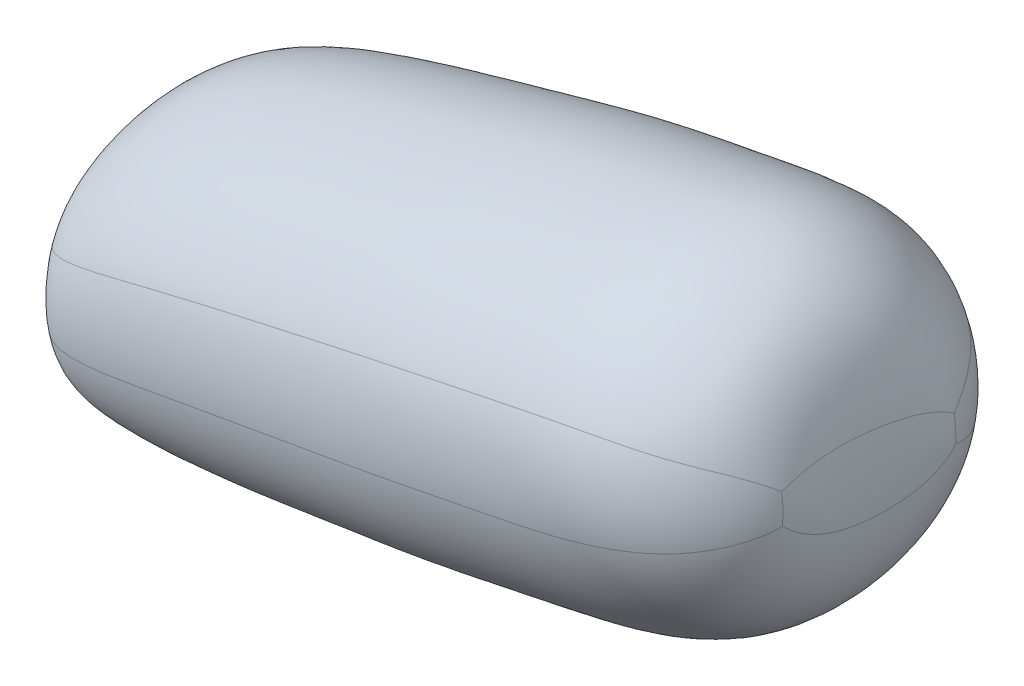
ISO-10303-21;
HEADER;
FILE_DESCRIPTION(('STEP AP214'),'2;1');
FILE_NAME('part.step','',(''),(''),'','','');
FILE_SCHEMA(('AUTOMOTIVE_DESIGN { 1 0 10303 214 1 1 1 1 }'));
ENDSEC;
DATA;
#1=APPLICATION_CONTEXT('core data for automotive mechanical design processes');
#2=APPLICATION_PROTOCOL_DEFINITION('international standard','automotive_design',2000,#1);
#3=PRODUCT_CONTEXT('',#1,'mechanical');
#4=PRODUCT('Part','Part','',(#3));
#5=PRODUCT_RELATED_PRODUCT_CATEGORY('part','',(#4));
#6=PRODUCT_DEFINITION_FORMATION('','',#4);
#7=PRODUCT_DEFINITION_CONTEXT('part definition',#1,'design');
#8=PRODUCT_DEFINITION('design','',#6,#7);
#9=PRODUCT_DEFINITION_SHAPE('','',#8);
#10=(LENGTH_UNIT() NAMED_UNIT(*) SI_UNIT(.MILLI.,.METRE.));
#11=(NAMED_UNIT(*) PLANE_ANGLE_UNIT() SI_UNIT($,.RADIAN.));
#12=(NAMED_UNIT(*) SI_UNIT($,.STERADIAN.) SOLID_ANGLE_UNIT());
#13=UNCERTAINTY_MEASURE_WITH_UNIT(LENGTH_MEASURE(1.E-05),#10,'distance_accuracy_value','');
#14=(GEOMETRIC_REPRESENTATION_CONTEXT(3) GLOBAL_UNCERTAINTY_ASSIGNED_CONTEXT((#13)) GLOBAL_UNIT_ASSIGNED_CONTEXT((#10,
#11,#12)) REPRESENTATION_CONTEXT('',''));
#15=CARTESIAN_POINT('',(0.,0.,0.));
#16=DIRECTION('',(0.,0.,1.));
#17=DIRECTION('',(1.,0.,0.));
#18=AXIS2_PLACEMENT_3D('',#15,#16,#17);
#19=CARTESIAN_POINT('',(-749.018489108599,1299.29948109935,-39.324095367069));
#20=CARTESIAN_POINT('',(-748.967970527326,1299.12750424513,-39.110239315957));
#21=CARTESIAN_POINT('',(-748.92179030598,1298.60052251188,-38.3957189993));
#22=CARTESIAN_POINT('',(-748.958201473464,1298.18935117655,-36.5443591677693));
#23=CARTESIAN_POINT('',(-749.06730665675,1298.22401597437,-34.3212711813403));
#24=CARTESIAN_POINT('',(-749.170756127106,1298.80543309046,-32.4720078110242));
#25=CARTESIAN_POINT('',(-749.317506592092,1299.42247015754,-31.7429129763975));
#26=CARTESIAN_POINT('',(-749.403490624089,1299.62465892125,-31.534316593217));
#27=CARTESIAN_POINT('',(-749.084801293097,1299.15543549282,-39.5639044364465));
#28=CARTESIAN_POINT('',(-749.050076315045,1298.6674361778,-39.3760014036215));
#29=CARTESIAN_POINT('',(-748.985153114867,1297.81794342647,-38.6020268331485));
#30=CARTESIAN_POINT('',(-749.003595215529,1297.12819720907,-36.5922889361603));
#31=CARTESIAN_POINT('',(-749.103906166947,1297.14203600984,-34.1606330428698));
#32=CARTESIAN_POINT('',(-749.21027710687,1298.01210105519,-32.195730785236));
#33=CARTESIAN_POINT('',(-749.393274203634,1298.96932822741,-31.4265141414041));
#34=CARTESIAN_POINT('',(-749.484366445849,1299.49918233803,-31.271818984141));
#35=CARTESIAN_POINT('',(-749.508277162153,1298.74760625145,-40.6770262946794));
#36=CARTESIAN_POINT('',(-749.457142232618,1297.9445234195,-40.4426507010464));
#37=CARTESIAN_POINT('',(-749.367864881999,1296.45824750499,-39.4598318134615));
#38=CARTESIAN_POINT('',(-749.365095308155,1295.21242315377,-36.880036828837));
#39=CARTESIAN_POINT('',(-749.482926647528,1295.19038210665,-33.7122038886789));
#40=CARTESIAN_POINT('',(-749.597785347056,1296.68025179217,-31.240581718492));
#41=CARTESIAN_POINT('',(-749.856086266719,1298.32539989258,-30.280357343591));
#42=CARTESIAN_POINT('',(-749.994240268324,1299.19221905066,-30.101039113443));
#43=CARTESIAN_POINT('',(-751.159048941229,1298.16258940699,-42.5300455490338));
#44=CARTESIAN_POINT('',(-751.090687071207,1297.03134036523,-42.2196471369537));
#45=CARTESIAN_POINT('',(-750.978551612935,1294.87144813529,-40.9205553568457));
#46=CARTESIAN_POINT('',(-750.988372541417,1293.06125687586,-37.4365631027926));
#47=CARTESIAN_POINT('',(-751.134682309766,1293.02708353821,-33.1428445734876));
#48=CARTESIAN_POINT('',(-751.290374837949,1295.13961801561,-29.7994822974853));
#49=CARTESIAN_POINT('',(-751.627641014105,1297.50126731871,-28.5577501991672));
#50=CARTESIAN_POINT('',(-751.811747843912,1298.71780496861,-28.3326523664718));
#51=CARTESIAN_POINT('',(-754.158873201719,1297.75222147314,-44.0965083970222));
#52=CARTESIAN_POINT('',(-754.077910358466,1296.39955738274,-43.7583014981308));
#53=CARTESIAN_POINT('',(-753.928371940029,1293.79672174144,-42.2544839683137));
#54=CARTESIAN_POINT('',(-753.938958652394,1291.66455529155,-38.1002551368529));
#55=CARTESIAN_POINT('',(-754.13647904971,1291.51711330299,-32.7432197820254));
#56=CARTESIAN_POINT('',(-754.185157446263,1294.0676880279,-28.8668044504918));
#57=CARTESIAN_POINT('',(-754.624464378787,1296.90228974008,-27.3498840460618));
#58=CARTESIAN_POINT('',(-754.874130672876,1298.36102383991,-27.0934864291307));
#59=CARTESIAN_POINT('',(-759.26000710208,1296.72639174894,-44.0891917319843));
#60=CARTESIAN_POINT('',(-759.18851954643,1295.38452932136,-43.7633730580967));
#61=CARTESIAN_POINT('',(-759.116812474931,1292.81342528136,-42.3663472178732));
#62=CARTESIAN_POINT('',(-759.051041510436,1290.60776673528,-38.1766387792012));
#63=CARTESIAN_POINT('',(-759.269596267115,1290.50681291285,-32.8324553525363));
#64=CARTESIAN_POINT('',(-759.272844685512,1293.11555768788,-28.6960862887956));
#65=CARTESIAN_POINT('',(-759.591990000017,1295.92878957771,-27.3696049029176));
#66=CARTESIAN_POINT('',(-759.77769174863,1297.36904152769,-27.1633438603408));
#67=CARTESIAN_POINT('',(-764.359546670865,1295.68972114741,-44.1376753076099));
#68=CARTESIAN_POINT('',(-764.297089733093,1294.34977516214,-43.8221455308439));
#69=CARTESIAN_POINT('',(-764.303269737728,1291.79346136581,-42.5233058448082));
#70=CARTESIAN_POINT('',(-764.160389916762,1289.49914396155,-38.2699856202754));
#71=CARTESIAN_POINT('',(-764.401397803234,1289.44428503148,-32.9030554621092));
#72=CARTESIAN_POINT('',(-764.359061717345,1292.12898631363,-28.4774306201283));
#73=CARTESIAN_POINT('',(-764.559338774294,1294.93947886125,-27.3338043413325));
#74=CARTESIAN_POINT('',(-764.681875497786,1296.37073541332,-27.176637277944));
#75=CARTESIAN_POINT('',(-769.305606388331,1294.47853407106,-43.9757094274412));
#76=CARTESIAN_POINT('',(-769.246511662497,1293.17488125367,-43.6646025869355));
#77=CARTESIAN_POINT('',(-769.212113710219,1290.70196483442,-42.4015593398651));
#78=CARTESIAN_POINT('',(-769.304153882563,1288.39490198021,-38.2746156648655));
#79=CARTESIAN_POINT('',(-769.638567077451,1288.42085571348,-33.0708250204242));
#80=CARTESIAN_POINT('',(-769.791654617071,1291.08685156502,-28.8648737740316));
#81=CARTESIAN_POINT('',(-769.980697436857,1293.71909715483,-27.7920740561139));
#82=CARTESIAN_POINT('',(-770.097800696493,1295.06803403571,-27.6409434635129));
#83=CARTESIAN_POINT('',(-774.25007321349,1293.2564999452,-43.8695401630141));
#84=CARTESIAN_POINT('',(-774.193946683919,1291.98026506041,-43.5607703619638));
#85=CARTESIAN_POINT('',(-774.11912298826,1289.5738509498,-42.3249542532714));
#86=CARTESIAN_POINT('',(-774.445027816653,1287.23881556464,-38.2961756445218));
#87=CARTESIAN_POINT('',(-774.874497234806,1287.3452149008,-33.2199760600337));
#88=CARTESIAN_POINT('',(-775.22270074493,1290.01025978561,-29.2043624787532));
#89=CARTESIAN_POINT('',(-775.40180525547,1292.48287601004,-28.1947998693385));
#90=CARTESIAN_POINT('',(-775.514300015313,1293.75898516807,-28.0486692270428));
#91=CARTESIAN_POINT('',(-779.911553258602,1291.88637305131,-43.5344845722859));
#92=CARTESIAN_POINT('',(-779.842074284409,1290.74448452939,-43.205979995121));
#93=CARTESIAN_POINT('',(-779.792314523312,1288.64156983473,-41.9549361328682));
#94=CARTESIAN_POINT('',(-779.969726307725,1286.89547436391,-38.1059025561277));
#95=CARTESIAN_POINT('',(-780.553360116567,1287.11002160491,-33.7430399077221));
#96=CARTESIAN_POINT('',(-780.980196818926,1289.03294102993,-29.8617816019272));
#97=CARTESIAN_POINT('',(-781.03489619997,1291.10256307089,-28.84410530136));
#98=CARTESIAN_POINT('',(-781.088692801074,1292.24591161954,-28.6597444598045));
#99=CARTESIAN_POINT('',(-781.954415149053,1291.85897094687,-41.9991583653068));
#100=CARTESIAN_POINT('',(-781.899991490325,1290.96449120507,-41.7418302327256));
#101=CARTESIAN_POINT('',(-781.860985650573,1289.31721902203,-40.7618449133627));
#102=CARTESIAN_POINT('',(-781.999978437645,1287.9494414387,-37.7467711875539));
#103=CARTESIAN_POINT('',(-782.457077583786,1288.11749766296,-34.3291798409091));
#104=CARTESIAN_POINT('',(-782.791436032879,1289.62377116702,-31.2888533829023));
#105=CARTESIAN_POINT('',(-782.834336592248,1291.24498764779,-30.491688903686));
#106=CARTESIAN_POINT('',(-782.876484609966,1292.14061199119,-30.3472751262383));
#107=CARTESIAN_POINT('',(-783.221014010632,1292.39643433713,-40.1129098322217));
#108=CARTESIAN_POINT('',(-783.185654987031,1291.81502241681,-39.945649891934));
#109=CARTESIAN_POINT('',(-783.160356054684,1290.74429501344,-39.3086711764158));
#110=CARTESIAN_POINT('',(-783.250644958287,1289.8552215429,-37.348858823631));
#111=CARTESIAN_POINT('',(-783.547699954565,1289.96444192545,-35.1274042024291));
#112=CARTESIAN_POINT('',(-783.765113193625,1290.94355771966,-33.1512189835104));
#113=CARTESIAN_POINT('',(-783.792976731724,1291.99733347087,-32.6330566996435));
#114=CARTESIAN_POINT('',(-783.82037407827,1292.57948616962,-32.5391871890176));
#115=CARTESIAN_POINT('',(-783.733798016317,1292.70464010443,-38.9131388769745));
#116=CARTESIAN_POINT('',(-783.710221372087,1292.31703033071,-38.8016304198931));
#117=CARTESIAN_POINT('',(-783.693372327786,1291.60321543548,-38.3769822774933));
#118=CARTESIAN_POINT('',(-783.753536996822,1291.0105076156,-37.0704397479077));
#119=CARTESIAN_POINT('',(-783.951627932896,1291.0833114502,-35.5894764019633));
#120=CARTESIAN_POINT('',(-784.096515664814,1291.73606479513,-34.2720140423367));
#121=CARTESIAN_POINT('',(-784.115074549976,1292.43857877002,-33.9265676154748));
#122=CARTESIAN_POINT('',(-784.133335485837,1292.82667874234,-33.863986111523));
#123=CARTESIAN_POINT('',(-783.824624994582,1292.82199442778,-38.690211108755));
#124=CARTESIAN_POINT('',(-783.85825016158,1292.68686670258,-38.5229929961155));
#125=CARTESIAN_POINT('',(-783.848229116781,1292.23721064092,-38.1581383824137));
#126=CARTESIAN_POINT('',(-783.906715497853,1291.87580281172,-37.0328917067888));
#127=CARTESIAN_POINT('',(-784.072418456832,1291.93059691732,-35.7467567036758));
#128=CARTESIAN_POINT('',(-784.192393077936,1292.34204792775,-34.5957010465759));
#129=CARTESIAN_POINT('',(-784.206751996864,1292.791077441,-34.2763311735864));
#130=CARTESIAN_POINT('',(-784.188366805151,1292.93231119889,-34.1180223182479));
#131=(BOUNDED_SURFACE() B_SPLINE_SURFACE(3,3,((#19,#20,#21,#22,#23,#24,#25,#26),(#27,#28,#29,
#30,#31,#32,#33,#34),(#35,#36,#37,#38,#39,#40,#41,#42),(#43,#44,#45,#46,#47,#48,#49,#50),(#51,
#52,#53,#54,#55,#56,#57,#58),(#59,#60,#61,#62,#63,#64,#65,#66),(#67,#68,#69,#70,#71,#72,#73,
#74),(#75,#76,#77,#78,#79,#80,#81,#82),(#83,#84,#85,#86,#87,#88,#89,#90),(#91,#92,#93,#94,#95,
#96,#97,#98),(#99,#100,#101,#102,#103,#104,#105,#106),(#107,#108,#109,#110,#111,#112,#113,#114),
(#115,#116,#117,#118,#119,#120,#121,#122),(#123,#124,#125,#126,#127,#128,#129,#130)),
.UNSPECIFIED.,.F.,.F.,.F.) B_SPLINE_SURFACE_WITH_KNOTS((4,1,1,1,1,1,1,1,1,1,1,4),(4,1,1,1,1,4),
(0.,1.,2.,3.,4.,5.,6.,7.,8.,9.,10.,11.),(0.,1.,2.,3.,4.,5.),
.UNSPECIFIED.) GEOMETRIC_REPRESENTATION_ITEM() RATIONAL_B_SPLINE_SURFACE(((0.75,1.,1.,1.,1.,1.,
1.,0.75),(1.,1.,1.,1.,1.,1.,1.,1.),(1.,1.,1.,1.,1.,1.,1.,1.),(1.,1.,1.,1.,1.,1.,1.,1.),(1.,1.,
1.,1.,1.,1.,1.,1.),(1.,1.,1.,1.,1.,1.,1.,1.),(1.,1.,1.,1.,1.,1.,1.,1.),(1.,1.,1.,1.,1.,1.,1.,
1.),(1.,1.,1.,1.,1.,1.,1.,1.),(1.,1.,1.,1.,1.,1.,1.,1.),(1.,1.,1.,1.,1.,1.,1.,1.),(1.,1.,1.,1.,
1.,1.,1.,1.),(1.,1.,1.,1.,1.,1.,1.,1.),(0.75,1.,1.,1.,1.,1.,1.,0.75))) REPRESENTATION_ITEM('') SURFACE());
#132=CARTESIAN_POINT('',(-783.824624994582,1292.82199442778,-38.690211108755));
#133=CARTESIAN_POINT('',(-783.733798016317,1292.70464010443,-38.9131388769745));
#134=CARTESIAN_POINT('',(-783.221014010632,1292.39643433713,-40.1129098322217));
#135=CARTESIAN_POINT('',(-781.954415149053,1291.85897094687,-41.9991583653068));
#136=CARTESIAN_POINT('',(-779.911553258602,1291.88637305131,-43.5344845722859));
#137=CARTESIAN_POINT('',(-774.25007321349,1293.2564999452,-43.8695401630141));
#138=CARTESIAN_POINT('',(-769.305606388331,1294.47853407106,-43.9757094274412));
#139=CARTESIAN_POINT('',(-764.359546670865,1295.68972114741,-44.1376753076099));
#140=CARTESIAN_POINT('',(-759.26000710208,1296.72639174894,-44.0891917319843));
#141=CARTESIAN_POINT('',(-754.158873201719,1297.75222147314,-44.0965083970222));
#142=CARTESIAN_POINT('',(-751.159048941229,1298.16258940699,-42.5300455490338));
#143=CARTESIAN_POINT('',(-749.508277162153,1298.74760625145,-40.6770262946794));
#144=CARTESIAN_POINT('',(-749.084801293097,1299.15543549282,-39.5639044364465));
#145=CARTESIAN_POINT('',(-749.018489108599,1299.29948109935,-39.324095367069));
#146=(BOUNDED_CURVE() B_SPLINE_CURVE(3,(#132,#133,#134,#135,#136,#137,#138,#139,#140,#141,#142,
#143,#144,#145),.UNSPECIFIED.,.F.,.F.) B_SPLINE_CURVE_WITH_KNOTS((4,1,1,1,1,1,1,1,1,1,1,4),(0.,
1.,2.,3.,4.,5.,6.,7.,8.,9.,10.,11.),
.UNSPECIFIED.) CURVE() GEOMETRIC_REPRESENTATION_ITEM() RATIONAL_B_SPLINE_CURVE((0.75,1.,1.,1.,
1.,1.,1.,1.,1.,1.,1.,1.,1.,0.75)) REPRESENTATION_ITEM(''));
#147=CARTESIAN_POINT('',(-783.824624994582,1292.82199442778,-38.690211108755));
#148=VERTEX_POINT('',#147);
#149=CARTESIAN_POINT('',(-749.018489108599,1299.29948109935,-39.324095367069));
#150=VERTEX_POINT('',#149);
#151=EDGE_CURVE('E95',#148,#150,#146,.T.);
#152=CARTESIAN_POINT('',(-749.018489108599,1299.29948109935,-39.324095367069));
#153=CARTESIAN_POINT('',(-748.967970527326,1299.12750424513,-39.110239315957));
#154=CARTESIAN_POINT('',(-748.92179030598,1298.60052251188,-38.3957189993));
#155=CARTESIAN_POINT('',(-748.958201473464,1298.18935117655,-36.5443591677693));
#156=CARTESIAN_POINT('',(-749.06730665675,1298.22401597437,-34.3212711813403));
#157=CARTESIAN_POINT('',(-749.170756127106,1298.80543309046,-32.4720078110242));
#158=CARTESIAN_POINT('',(-749.317506592092,1299.42247015754,-31.7429129763975));
#159=CARTESIAN_POINT('',(-749.403490624089,1299.62465892125,-31.534316593217));
#160=(BOUNDED_CURVE() B_SPLINE_CURVE(3,(#152,#153,#154,#155,#156,#157,#158,#159),.UNSPECIFIED.,
.F.,.F.) B_SPLINE_CURVE_WITH_KNOTS((4,1,1,1,1,4),(0.,1.,2.,3.,4.,5.),
.UNSPECIFIED.) CURVE() GEOMETRIC_REPRESENTATION_ITEM() RATIONAL_B_SPLINE_CURVE((0.75,1.,1.,1.,
1.,1.,1.,0.75)) REPRESENTATION_ITEM(''));
#161=CARTESIAN_POINT('',(-749.403490624089,1299.62465892125,-31.534316593217));
#162=VERTEX_POINT('',#161);
#163=EDGE_CURVE('E82',#150,#162,#160,.T.);
#164=CARTESIAN_POINT('',(-749.403490624089,1299.62465892125,-31.534316593217));
#165=CARTESIAN_POINT('',(-749.484366445849,1299.49918233803,-31.271818984141));
#166=CARTESIAN_POINT('',(-749.994240268324,1299.19221905066,-30.101039113443));
#167=CARTESIAN_POINT('',(-751.811747843912,1298.71780496861,-28.3326523664718));
#168=CARTESIAN_POINT('',(-754.874130672876,1298.36102383991,-27.0934864291307));
#169=CARTESIAN_POINT('',(-759.77769174863,1297.36904152769,-27.1633438603408));
#170=CARTESIAN_POINT('',(-764.681875497786,1296.37073541332,-27.176637277944));
#171=CARTESIAN_POINT('',(-770.097800696493,1295.06803403571,-27.6409434635129));
#172=CARTESIAN_POINT('',(-775.514300015313,1293.75898516807,-28.0486692270428));
#173=CARTESIAN_POINT('',(-781.088692801074,1292.24591161954,-28.6597444598045));
#174=CARTESIAN_POINT('',(-782.876484609966,1292.14061199119,-30.3472751262383));
#175=CARTESIAN_POINT('',(-783.82037407827,1292.57948616962,-32.5391871890176));
#176=CARTESIAN_POINT('',(-784.133335485837,1292.82667874234,-33.863986111523));
#177=CARTESIAN_POINT('',(-784.188366805151,1292.93231119889,-34.1180223182479));
#178=(BOUNDED_CURVE() B_SPLINE_CURVE(3,(#164,#165,#166,#167,#168,#169,#170,#171,#172,#173,#174,
#175,#176,#177),.UNSPECIFIED.,.F.,.F.) B_SPLINE_CURVE_WITH_KNOTS((4,1,1,1,1,1,1,1,1,1,1,4),(0.,
1.,2.,3.,4.,5.,6.,7.,8.,9.,10.,11.),
.UNSPECIFIED.) CURVE() GEOMETRIC_REPRESENTATION_ITEM() RATIONAL_B_SPLINE_CURVE((0.75,1.,1.,1.,
1.,1.,1.,1.,1.,1.,1.,1.,1.,0.75)) REPRESENTATION_ITEM(''));
#179=CARTESIAN_POINT('',(-784.188366805151,1292.93231119889,-34.1180223182479));
#180=VERTEX_POINT('',#179);
#181=EDGE_CURVE('E109',#162,#180,#178,.T.);
#182=CARTESIAN_POINT('',(-783.824624994582,1292.82199442778,-38.690211108755));
#183=CARTESIAN_POINT('',(-783.85825016158,1292.68686670258,-38.5229929961155));
#184=CARTESIAN_POINT('',(-783.848229116781,1292.23721064092,-38.1581383824137));
#185=CARTESIAN_POINT('',(-783.906715497853,1291.87580281172,-37.0328917067888));
#186=CARTESIAN_POINT('',(-784.072418456832,1291.93059691732,-35.7467567036758));
#187=CARTESIAN_POINT('',(-784.192393077936,1292.34204792775,-34.5957010465759));
#188=CARTESIAN_POINT('',(-784.206751996864,1292.791077441,-34.2763311735864));
#189=CARTESIAN_POINT('',(-784.188366805151,1292.93231119889,-34.1180223182479));
#190=(BOUNDED_CURVE() B_SPLINE_CURVE(3,(#182,#183,#184,#185,#186,#187,#188,#189),.UNSPECIFIED.,
.F.,.F.) B_SPLINE_CURVE_WITH_KNOTS((4,1,1,1,1,4),(0.,1.,2.,3.,4.,5.),
.UNSPECIFIED.) CURVE() GEOMETRIC_REPRESENTATION_ITEM() RATIONAL_B_SPLINE_CURVE((0.75,1.,1.,1.,
1.,1.,1.,0.75)) REPRESENTATION_ITEM(''));
#191=EDGE_CURVE('E73',#180,#148,#190,.F.);
#192=ORIENTED_EDGE('',*,*,#151,.T.);
#193=ORIENTED_EDGE('',*,*,#163,.T.);
#194=ORIENTED_EDGE('',*,*,#181,.T.);
#195=ORIENTED_EDGE('',*,*,#191,.T.);
#196=EDGE_LOOP('',(#192,#193,#194,#195));
#197=FACE_BOUND('',#196,.T.);
#198=ADVANCED_FACE('F33',(#197),#131,.F.);
#199=CARTESIAN_POINT('',(-749.101198099589,1300.48404316382,-39.3215295309405));
#200=CARTESIAN_POINT('',(-749.073539835806,1300.62872121467,-39.1119811715683));
#201=CARTESIAN_POINT('',(-749.100866221287,1301.05505212928,-38.4399309260042));
#202=CARTESIAN_POINT('',(-749.212592360472,1301.48810966363,-36.6750381359092));
#203=CARTESIAN_POINT('',(-749.398164468555,1301.5930330535,-34.5895874505852));
#204=CARTESIAN_POINT('',(-749.489537624244,1301.36069646779,-32.6765632122549));
#205=CARTESIAN_POINT('',(-749.535269738027,1300.99402252503,-31.9036791666968));
#206=CARTESIAN_POINT('',(-749.578894700072,1300.86605871129,-31.6665667225681));
#207=CARTESIAN_POINT('',(-749.040850375049,1300.17046956504,-39.2934519756941));
#208=CARTESIAN_POINT('',(-748.925186122951,1300.14625206791,-38.8462777017031));
#209=CARTESIAN_POINT('',(-748.923057762875,1300.26841180734,-38.2056979879056));
#210=CARTESIAN_POINT('',(-749.002770293597,1300.41492605134,-36.544443808918));
#211=CARTESIAN_POINT('',(-749.147018366461,1300.49412891637,-34.5789710196671));
#212=CARTESIAN_POINT('',(-749.245947307902,1300.51950456478,-32.8232643550117));
#213=CARTESIAN_POINT('',(-749.321609789028,1300.45993178052,-32.1190310824601));
#214=CARTESIAN_POINT('',(-749.49387720659,1300.53503143215,-31.6556864583636));
#215=CARTESIAN_POINT('',(-749.002695505377,1299.61550356014,-39.2981423487929));
#216=CARTESIAN_POINT('',(-748.885864739596,1299.58757231245,-38.8444772283143));
#217=CARTESIAN_POINT('',(-748.858427497092,1299.38310159727,-38.1894111654515));
#218=CARTESIAN_POINT('',(-748.912807731408,1299.25050514402,-36.4964293993673));
#219=CARTESIAN_POINT('',(-749.030707146552,1299.3059959389,-34.4819093198216));
#220=CARTESIAN_POINT('',(-749.131235147342,1299.59876512575,-32.7482848368125));
#221=CARTESIAN_POINT('',(-749.241738980559,1299.87561208766,-32.0593118113908));
#222=CARTESIAN_POINT('',(-749.408598834316,1299.95232426816,-31.5882178191343));
#223=CARTESIAN_POINT('',(-749.018489108599,1299.29948109935,-39.324095367069));
#224=CARTESIAN_POINT('',(-748.967970527326,1299.12750424513,-39.110239315957));
#225=CARTESIAN_POINT('',(-748.92179030598,1298.60052251188,-38.3957189993));
#226=CARTESIAN_POINT('',(-748.958201473464,1298.18935117655,-36.5443591677693));
#227=CARTESIAN_POINT('',(-749.06730665675,1298.22401597437,-34.3212711813403));
#228=CARTESIAN_POINT('',(-749.170756127106,1298.80543309046,-32.4720078110242));
#229=CARTESIAN_POINT('',(-749.317506592092,1299.42247015754,-31.7429129763975));
#230=CARTESIAN_POINT('',(-749.403490624089,1299.62465892125,-31.534316593217));
#231=(BOUNDED_SURFACE() B_SPLINE_SURFACE(3,3,((#199,#200,#201,#202,#203,#204,#205,#206),(#207,
#208,#209,#210,#211,#212,#213,#214),(#215,#216,#217,#218,#219,#220,#221,#222),(#223,#224,#225,
#226,#227,#228,#229,#230)),.UNSPECIFIED.,.F.,.F.,.F.) B_SPLINE_SURFACE_WITH_KNOTS((4,4),(4,1,1,
1,1,4),(0.,1.),(0.,1.,2.,3.,4.,5.),
.UNSPECIFIED.) GEOMETRIC_REPRESENTATION_ITEM() RATIONAL_B_SPLINE_SURFACE(((0.75,1.,1.,1.,1.,1.,
1.,0.75),(1.,1.,1.,1.,1.,1.,1.,1.),(1.,1.,1.,1.,1.,1.,1.,1.),(0.75,1.,1.,1.,1.,1.,1.,0.75))) REPRESENTATION_ITEM('') SURFACE());
#232=CARTESIAN_POINT('',(-749.101198099589,1300.48404316382,-39.3215295309405));
#233=CARTESIAN_POINT('',(-749.040850375049,1300.17046956504,-39.2934519756941));
#234=CARTESIAN_POINT('',(-749.002695505377,1299.61550356014,-39.2981423487929));
#235=CARTESIAN_POINT('',(-749.018489108599,1299.29948109935,-39.324095367069));
#236=(BOUNDED_CURVE() B_SPLINE_CURVE(3,(#232,#233,#234,#235),.UNSPECIFIED.,.F.,
.F.) B_SPLINE_CURVE_WITH_KNOTS((4,4),(0.,1.),
.UNSPECIFIED.) CURVE() GEOMETRIC_REPRESENTATION_ITEM() RATIONAL_B_SPLINE_CURVE((0.75,1.,1.,0.75)) REPRESENTATION_ITEM(''));
#237=CARTESIAN_POINT('',(-749.101198099589,1300.48404316382,-39.3215295309405));
#238=VERTEX_POINT('',#237);
#239=EDGE_CURVE('E89',#150,#238,#236,.F.);
#240=CARTESIAN_POINT('',(-749.578894700072,1300.86605871129,-31.6665667225681));
#241=CARTESIAN_POINT('',(-749.535269738027,1300.99402252503,-31.9036791666968));
#242=CARTESIAN_POINT('',(-749.489537624244,1301.36069646779,-32.6765632122549));
#243=CARTESIAN_POINT('',(-749.398164468555,1301.5930330535,-34.5895874505852));
#244=CARTESIAN_POINT('',(-749.212592360472,1301.48810966363,-36.6750381359092));
#245=CARTESIAN_POINT('',(-749.100866221287,1301.05505212928,-38.4399309260042));
#246=CARTESIAN_POINT('',(-749.073539835806,1300.62872121467,-39.1119811715683));
#247=CARTESIAN_POINT('',(-749.101198099589,1300.48404316382,-39.3215295309405));
#248=(BOUNDED_CURVE() B_SPLINE_CURVE(3,(#240,#241,#242,#243,#244,#245,#246,#247),.UNSPECIFIED.,
.F.,.F.) B_SPLINE_CURVE_WITH_KNOTS((4,1,1,1,1,4),(0.,1.,2.,3.,4.,5.),
.UNSPECIFIED.) CURVE() GEOMETRIC_REPRESENTATION_ITEM() RATIONAL_B_SPLINE_CURVE((0.75,1.,1.,1.,
1.,1.,1.,0.75)) REPRESENTATION_ITEM(''));
#249=CARTESIAN_POINT('',(-749.578894700072,1300.86605871129,-31.6665667225681));
#250=VERTEX_POINT('',#249);
#251=EDGE_CURVE('E54',#238,#250,#248,.F.);
#252=CARTESIAN_POINT('',(-749.403490624089,1299.62465892125,-31.534316593217));
#253=CARTESIAN_POINT('',(-749.408598834316,1299.95232426816,-31.5882178191343));
#254=CARTESIAN_POINT('',(-749.49387720659,1300.53503143215,-31.6556864583636));
#255=CARTESIAN_POINT('',(-749.578894700072,1300.86605871129,-31.6665667225681));
#256=(BOUNDED_CURVE() B_SPLINE_CURVE(3,(#252,#253,#254,#255),.UNSPECIFIED.,.F.,
.F.) B_SPLINE_CURVE_WITH_KNOTS((4,4),(0.,1.),
.UNSPECIFIED.) CURVE() GEOMETRIC_REPRESENTATION_ITEM() RATIONAL_B_SPLINE_CURVE((0.75,1.,1.,0.75)) REPRESENTATION_ITEM(''));
#257=EDGE_CURVE('E65',#250,#162,#256,.F.);
#258=ORIENTED_EDGE('',*,*,#239,.T.);
#259=ORIENTED_EDGE('',*,*,#251,.T.);
#260=ORIENTED_EDGE('',*,*,#257,.T.);
#261=ORIENTED_EDGE('',*,*,#163,.F.);
#262=EDGE_LOOP('',(#258,#259,#260,#261));
#263=FACE_BOUND('',#262,.T.);
#264=ADVANCED_FACE('F88',(#263),#231,.F.);
#265=CARTESIAN_POINT('',(-783.893814342729,1293.77587627241,-38.7183294621177));
#266=CARTESIAN_POINT('',(-783.820694845313,1293.89112847798,-38.9479489627941));
#267=CARTESIAN_POINT('',(-783.351322479163,1294.17615501707,-40.1651114212732));
#268=CARTESIAN_POINT('',(-782.154925746226,1294.59700567594,-42.0794753155524));
#269=CARTESIAN_POINT('',(-780.167567816432,1295.38172499271,-43.637022510016));
#270=CARTESIAN_POINT('',(-774.497658475344,1297.06253696188,-43.8848743225744));
#271=CARTESIAN_POINT('',(-769.570695864869,1298.35809562624,-43.9680247127822));
#272=CARTESIAN_POINT('',(-764.644056524665,1299.66919865489,-44.1067819397449));
#273=CARTESIAN_POINT('',(-759.532067791023,1300.69865071291,-44.0252837542906));
#274=CARTESIAN_POINT('',(-754.420505250228,1301.74365689664,-43.9994168210762));
#275=CARTESIAN_POINT('',(-751.398107733031,1301.54151953421,-42.5157692096575));
#276=CARTESIAN_POINT('',(-749.67685445444,1301.16871211375,-40.662820602951));
#277=CARTESIAN_POINT('',(-749.189204087912,1300.65293871178,-39.5591554455591));
#278=CARTESIAN_POINT('',(-749.101198099589,1300.48404316382,-39.3215295309405));
#279=CARTESIAN_POINT('',(-783.918078382228,1293.52796691963,-38.6472153189055));
#280=CARTESIAN_POINT('',(-783.796103426886,1293.51056197799,-39.0353401770133));
#281=CARTESIAN_POINT('',(-783.314441615238,1293.60530639639,-40.2962002953258));
#282=CARTESIAN_POINT('',(-782.098183205346,1293.71877408076,-42.281150103342));
#283=CARTESIAN_POINT('',(-780.0951103006,1294.26058126979,-43.8944763726819));
#284=CARTESIAN_POINT('',(-774.381040954399,1295.88199754423,-44.1779415118188));
#285=CARTESIAN_POINT('',(-769.465691589695,1297.15303431359,-44.2775083254067));
#286=CARTESIAN_POINT('',(-764.550007486482,1298.43140220508,-44.4348447948741));
#287=CARTESIAN_POINT('',(-759.438616233273,1299.46642701167,-44.3681348335301));
#288=CARTESIAN_POINT('',(-754.326992522281,1300.50879592372,-44.3592203287496));
#289=CARTESIAN_POINT('',(-751.308066822149,1300.47639041731,-42.8116948952093));
#290=CARTESIAN_POINT('',(-749.617043275484,1300.41371679005,-40.8887436318294));
#291=CARTESIAN_POINT('',(-749.156514627145,1300.19468706216,-39.7406262496741));
#292=CARTESIAN_POINT('',(-749.040850375049,1300.17046956504,-39.2934519756941));
#293=CARTESIAN_POINT('',(-783.88182680582,1293.0744764763,-38.6345014531969));
#294=CARTESIAN_POINT('',(-783.757374660566,1293.09224987815,-39.0246473340667));
#295=CARTESIAN_POINT('',(-783.256373034223,1292.97784625745,-40.2801697725095));
#296=CARTESIAN_POINT('',(-782.008838807773,1292.75345068867,-42.2564864978881));
#297=CARTESIAN_POINT('',(-779.981032232778,1293.02826157324,-43.8629891494619));
#298=CARTESIAN_POINT('',(-774.30619974307,1294.53273482997,-44.1783099640644));
#299=CARTESIAN_POINT('',(-769.364701114166,1295.78218688845,-44.286816267936));
#300=CARTESIAN_POINT('',(-764.422003608637,1297.02966713269,-44.4532050843542));
#301=CARTESIAN_POINT('',(-759.331494657729,1298.06825417651,-44.4150104058611));
#302=CARTESIAN_POINT('',(-754.239836044974,1299.10488556355,-44.4347152958918));
#303=CARTESIAN_POINT('',(-751.227410811251,1299.29383844875,-42.8404439611031));
#304=CARTESIAN_POINT('',(-749.559412091697,1299.5506890834,-40.9114018883342));
#305=CARTESIAN_POINT('',(-749.11952627114,1299.64343480782,-39.7518074692715));
#306=CARTESIAN_POINT('',(-749.002695505377,1299.61550356014,-39.2981423487929));
#307=CARTESIAN_POINT('',(-783.824624994582,1292.82199442778,-38.690211108755));
#308=CARTESIAN_POINT('',(-783.733798016317,1292.70464010443,-38.9131388769745));
#309=CARTESIAN_POINT('',(-783.221014010632,1292.39643433713,-40.1129098322217));
#310=CARTESIAN_POINT('',(-781.954415149053,1291.85897094687,-41.9991583653068));
#311=CARTESIAN_POINT('',(-779.911553258602,1291.88637305131,-43.5344845722859));
#312=CARTESIAN_POINT('',(-774.25007321349,1293.2564999452,-43.8695401630141));
#313=CARTESIAN_POINT('',(-769.305606388331,1294.47853407106,-43.9757094274412));
#314=CARTESIAN_POINT('',(-764.359546670865,1295.68972114741,-44.1376753076099));
#315=CARTESIAN_POINT('',(-759.26000710208,1296.72639174894,-44.0891917319843));
#316=CARTESIAN_POINT('',(-754.158873201719,1297.75222147314,-44.0965083970222));
#317=CARTESIAN_POINT('',(-751.159048941229,1298.16258940699,-42.5300455490338));
#318=CARTESIAN_POINT('',(-749.508277162153,1298.74760625145,-40.6770262946794));
#319=CARTESIAN_POINT('',(-749.084801293097,1299.15543549282,-39.5639044364465));
#320=CARTESIAN_POINT('',(-749.018489108599,1299.29948109935,-39.324095367069));
#321=(BOUNDED_SURFACE() B_SPLINE_SURFACE(3,3,((#265,#266,#267,#268,#269,#270,#271,#272,#273,
#274,#275,#276,#277,#278),(#279,#280,#281,#282,#283,#284,#285,#286,#287,#288,#289,#290,#291,
#292),(#293,#294,#295,#296,#297,#298,#299,#300,#301,#302,#303,#304,#305,#306),(#307,#308,#309,
#310,#311,#312,#313,#314,#315,#316,#317,#318,#319,#320)),.UNSPECIFIED.,.F.,.F.,
.F.) B_SPLINE_SURFACE_WITH_KNOTS((4,4),(4,1,1,1,1,1,1,1,1,1,1,4),(0.,1.),(0.,1.,2.,3.,4.,5.,6.,
7.,8.,9.,10.,11.),
.UNSPECIFIED.) GEOMETRIC_REPRESENTATION_ITEM() RATIONAL_B_SPLINE_SURFACE(((0.75,1.,1.,1.,1.,1.,
1.,1.,1.,1.,1.,1.,1.,0.75),(1.,1.,1.,1.,1.,1.,1.,1.,1.,1.,1.,1.,1.,1.),(1.,1.,1.,1.,1.,1.,1.,1.,
1.,1.,1.,1.,1.,1.),(0.75,1.,1.,1.,1.,1.,1.,1.,1.,1.,1.,1.,1.,0.75))) REPRESENTATION_ITEM('') SURFACE());
#322=CARTESIAN_POINT('',(-783.893814342729,1293.77587627241,-38.7183294621177));
#323=CARTESIAN_POINT('',(-783.918078382228,1293.52796691963,-38.6472153189055));
#324=CARTESIAN_POINT('',(-783.88182680582,1293.0744764763,-38.6345014531969));
#325=CARTESIAN_POINT('',(-783.824624994582,1292.82199442778,-38.690211108755));
#326=(BOUNDED_CURVE() B_SPLINE_CURVE(3,(#322,#323,#324,#325),.UNSPECIFIED.,.F.,
.F.) B_SPLINE_CURVE_WITH_KNOTS((4,4),(0.,1.),
.UNSPECIFIED.) CURVE() GEOMETRIC_REPRESENTATION_ITEM() RATIONAL_B_SPLINE_CURVE((0.75,1.,1.,0.75)) REPRESENTATION_ITEM(''));
#327=CARTESIAN_POINT('',(-783.893814342729,1293.77587627241,-38.7183294621177));
#328=VERTEX_POINT('',#327);
#329=EDGE_CURVE('E98',#148,#328,#326,.F.);
#330=CARTESIAN_POINT('',(-749.101198099589,1300.48404316382,-39.3215295309405));
#331=CARTESIAN_POINT('',(-749.189204087912,1300.65293871178,-39.5591554455591));
#332=CARTESIAN_POINT('',(-749.67685445444,1301.16871211375,-40.662820602951));
#333=CARTESIAN_POINT('',(-751.398107733031,1301.54151953421,-42.5157692096575));
#334=CARTESIAN_POINT('',(-754.420505250228,1301.74365689664,-43.9994168210762));
#335=CARTESIAN_POINT('',(-759.532067791023,1300.69865071291,-44.0252837542906));
#336=CARTESIAN_POINT('',(-764.644056524665,1299.66919865489,-44.1067819397449));
#337=CARTESIAN_POINT('',(-769.570695864869,1298.35809562624,-43.9680247127822));
#338=CARTESIAN_POINT('',(-774.497658475344,1297.06253696188,-43.8848743225744));
#339=CARTESIAN_POINT('',(-780.167567816432,1295.38172499271,-43.637022510016));
#340=CARTESIAN_POINT('',(-782.154925746226,1294.59700567594,-42.0794753155524));
#341=CARTESIAN_POINT('',(-783.351322479163,1294.17615501707,-40.1651114212732));
#342=CARTESIAN_POINT('',(-783.820694845313,1293.89112847798,-38.9479489627941));
#343=CARTESIAN_POINT('',(-783.893814342729,1293.77587627241,-38.7183294621177));
#344=(BOUNDED_CURVE() B_SPLINE_CURVE(3,(#330,#331,#332,#333,#334,#335,#336,#337,#338,#339,#340,
#341,#342,#343),.UNSPECIFIED.,.F.,.F.) B_SPLINE_CURVE_WITH_KNOTS((4,1,1,1,1,1,1,1,1,1,1,4),(0.,
1.,2.,3.,4.,5.,6.,7.,8.,9.,10.,11.),
.UNSPECIFIED.) CURVE() GEOMETRIC_REPRESENTATION_ITEM() RATIONAL_B_SPLINE_CURVE((0.75,1.,1.,1.,
1.,1.,1.,1.,1.,1.,1.,1.,1.,0.75)) REPRESENTATION_ITEM(''));
#345=EDGE_CURVE('E96',#328,#238,#344,.F.);
#346=ORIENTED_EDGE('',*,*,#329,.T.);
#347=ORIENTED_EDGE('',*,*,#345,.T.);
#348=ORIENTED_EDGE('',*,*,#239,.F.);
#349=ORIENTED_EDGE('',*,*,#151,.F.);
#350=EDGE_LOOP('',(#346,#347,#348,#349));
#351=FACE_BOUND('',#350,.T.);
#352=ADVANCED_FACE('F94',(#351),#321,.F.);
#353=CARTESIAN_POINT('',(-783.893814342729,1293.77587627241,-38.7183294621177));
#354=CARTESIAN_POINT('',(-783.918078382228,1293.52796691963,-38.6472153189055));
#355=CARTESIAN_POINT('',(-783.88182680582,1293.0744764763,-38.6345014531969));
#356=CARTESIAN_POINT('',(-783.824624994582,1292.82199442778,-38.690211108755));
#357=CARTESIAN_POINT('',(-783.942669800637,1293.90853341962,-38.5598241046646));
#358=CARTESIAN_POINT('',(-784.04005333757,1293.54537186128,-38.2590904607868));
#359=CARTESIAN_POINT('',(-784.006278951084,1293.05670307447,-38.2443555723379));
#360=CARTESIAN_POINT('',(-783.85825016158,1292.68686670258,-38.5229929961155));
#361=CARTESIAN_POINT('',(-783.956242875976,1294.33353641223,-38.2285291761935));
#362=CARTESIAN_POINT('',(-784.046291347245,1293.70973604623,-37.9674511466468));
#363=CARTESIAN_POINT('',(-784.003085905793,1292.87120584637,-37.939294487334));
#364=CARTESIAN_POINT('',(-783.848229116781,1292.23721064092,-38.1581383824137));
#365=CARTESIAN_POINT('',(-784.043991262643,1294.75818127464,-37.1931782196702));
#366=CARTESIAN_POINT('',(-784.114804981715,1293.89404536369,-37.0594571212499));
#367=CARTESIAN_POINT('',(-784.059893998902,1292.74109800783,-36.9953436656589));
#368=CARTESIAN_POINT('',(-783.906715497853,1291.87580281172,-37.0328917067888));
#369=CARTESIAN_POINT('',(-784.17148808401,1294.76843219838,-35.9555720180807));
#370=CARTESIAN_POINT('',(-784.232826039489,1293.91301855628,-35.9875615090461));
#371=CARTESIAN_POINT('',(-784.193208980778,1292.77788238443,-35.9040370053883));
#372=CARTESIAN_POINT('',(-784.072418456832,1291.93059691732,-35.7467567036758));
#373=CARTESIAN_POINT('',(-784.257525206775,1294.38133954815,-34.8131459726309));
#374=CARTESIAN_POINT('',(-784.314324081726,1293.7637437879,-35.0063645298746));
#375=CARTESIAN_POINT('',(-784.288270491058,1292.94803106038,-34.919388050815));
#376=CARTESIAN_POINT('',(-784.192393077936,1292.34204792775,-34.5957010465759));
#377=CARTESIAN_POINT('',(-784.262515862838,1294.00201949661,-34.4082627704245));
#378=CARTESIAN_POINT('',(-784.320735428434,1293.6279508044,-34.6788663899836));
#379=CARTESIAN_POINT('',(-784.29842944377,1293.14357611199,-34.626094731687));
#380=CARTESIAN_POINT('',(-784.206751996864,1292.791077441,-34.2763311735864));
#381=CARTESIAN_POINT('',(-784.234623525494,1293.88125355503,-34.2218301179681));
#382=CARTESIAN_POINT('',(-784.249787139619,1293.63383623813,-34.2639156015249));
#383=CARTESIAN_POINT('',(-784.225012932725,1293.17917741332,-34.2137496696237));
#384=CARTESIAN_POINT('',(-784.188366805151,1292.93231119889,-34.1180223182479));
#385=(BOUNDED_SURFACE() B_SPLINE_SURFACE(3,3,((#353,#354,#355,#356),(#357,#358,#359,#360),(#361,
#362,#363,#364),(#365,#366,#367,#368),(#369,#370,#371,#372),(#373,#374,#375,#376),(#377,#378,
#379,#380),(#381,#382,#383,#384)),.UNSPECIFIED.,.F.,.F.,.F.) B_SPLINE_SURFACE_WITH_KNOTS((4,1,1,
1,1,4),(4,4),(0.,1.,2.,3.,4.,5.),(0.,1.),
.UNSPECIFIED.) GEOMETRIC_REPRESENTATION_ITEM() RATIONAL_B_SPLINE_SURFACE(((0.75,1.,1.,0.75),(1.,
1.,1.,1.),(1.,1.,1.,1.),(1.,1.,1.,1.),(1.,1.,1.,1.),(1.,1.,1.,1.),(1.,1.,1.,1.),(0.75,1.,1.,0.75))) REPRESENTATION_ITEM('') SURFACE());
#386=CARTESIAN_POINT('',(-784.234623525494,1293.88125355503,-34.2218301179681));
#387=CARTESIAN_POINT('',(-784.262515862838,1294.00201949661,-34.4082627704245));
#388=CARTESIAN_POINT('',(-784.257525206775,1294.38133954815,-34.8131459726309));
#389=CARTESIAN_POINT('',(-784.17148808401,1294.76843219838,-35.9555720180807));
#390=CARTESIAN_POINT('',(-784.043991262643,1294.75818127464,-37.1931782196702));
#391=CARTESIAN_POINT('',(-783.956242875967,1294.33353641223,-38.2285291761935));
#392=CARTESIAN_POINT('',(-783.942669800637,1293.90853341962,-38.5598241046646));
#393=CARTESIAN_POINT('',(-783.893814342729,1293.77587627241,-38.7183294621177));
#394=(BOUNDED_CURVE() B_SPLINE_CURVE(3,(#386,#387,#388,#389,#390,#391,#392,#393),.UNSPECIFIED.,
.F.,.F.) B_SPLINE_CURVE_WITH_KNOTS((4,1,1,1,1,4),(0.,1.,2.,3.,4.,5.),
.UNSPECIFIED.) CURVE() GEOMETRIC_REPRESENTATION_ITEM() RATIONAL_B_SPLINE_CURVE((0.75,1.,1.,1.,
1.,1.,1.,0.75)) REPRESENTATION_ITEM(''));
#395=CARTESIAN_POINT('',(-784.234623525494,1293.88125355503,-34.2218301179681));
#396=VERTEX_POINT('',#395);
#397=EDGE_CURVE('E46',#396,#328,#394,.T.);
#398=CARTESIAN_POINT('',(-784.188366805151,1292.93231119889,-34.1180223182479));
#399=CARTESIAN_POINT('',(-784.225012932725,1293.17917741332,-34.2137496696237));
#400=CARTESIAN_POINT('',(-784.249787139619,1293.63383623813,-34.2639156015249));
#401=CARTESIAN_POINT('',(-784.234623525494,1293.88125355503,-34.2218301179681));
#402=(BOUNDED_CURVE() B_SPLINE_CURVE(3,(#398,#399,#400,#401),.UNSPECIFIED.,.F.,
.F.) B_SPLINE_CURVE_WITH_KNOTS((4,4),(0.,1.),
.UNSPECIFIED.) CURVE() GEOMETRIC_REPRESENTATION_ITEM() RATIONAL_B_SPLINE_CURVE((0.75,1.,1.,0.75)) REPRESENTATION_ITEM(''));
#403=EDGE_CURVE('E116',#180,#396,#402,.T.);
#404=ORIENTED_EDGE('',*,*,#397,.T.);
#405=ORIENTED_EDGE('',*,*,#329,.F.);
#406=ORIENTED_EDGE('',*,*,#191,.F.);
#407=ORIENTED_EDGE('',*,*,#403,.T.);
#408=EDGE_LOOP('',(#404,#405,#406,#407));
#409=FACE_BOUND('',#408,.T.);
#410=ADVANCED_FACE('F165',(#409),#385,.F.);
#411=CARTESIAN_POINT('',(-749.403490624089,1299.62465892125,-31.534316593217));
#412=CARTESIAN_POINT('',(-749.408598834316,1299.95232426816,-31.5882178191343));
#413=CARTESIAN_POINT('',(-749.49387720659,1300.53503143215,-31.6556864583636));
#414=CARTESIAN_POINT('',(-749.578894700072,1300.86605871129,-31.6665667225681));
#415=CARTESIAN_POINT('',(-749.484366445849,1299.49918233803,-31.271818984141));
#416=CARTESIAN_POINT('',(-749.575458688083,1300.02903644866,-31.1171238268777));
#417=CARTESIAN_POINT('',(-749.666144624163,1300.6101310838,-31.1923418342781));
#418=CARTESIAN_POINT('',(-749.70753715559,1301.06912217668,-31.4403345426113));
#419=CARTESIAN_POINT('',(-749.994240268324,1299.19221905066,-30.101039113443));
#420=CARTESIAN_POINT('',(-750.132394269912,1300.05903820873,-29.9217208832841));
#421=CARTESIAN_POINT('',(-750.27955181329,1300.97010247467,-30.0431966104331));
#422=CARTESIAN_POINT('',(-750.361689839673,1301.73296966833,-30.3753388280822));
#423=CARTESIAN_POINT('',(-751.811747843912,1298.71780496861,-28.3326523664718));
#424=CARTESIAN_POINT('',(-751.995854673728,1299.93434261852,-28.1075545337656));
#425=CARTESIAN_POINT('',(-752.195435245255,1301.18659326679,-28.2782249175449));
#426=CARTESIAN_POINT('',(-752.318426191807,1302.27012775784,-28.7288358559058));
#427=CARTESIAN_POINT('',(-754.874130672876,1298.36102383991,-27.0934864291307));
#428=CARTESIAN_POINT('',(-755.123796966965,1299.81975793973,-26.8370888121997));
#429=CARTESIAN_POINT('',(-755.403476088881,1301.31992528329,-27.0827537805853));
#430=CARTESIAN_POINT('',(-755.557823731602,1302.59134338295,-27.6283842670094));
#431=CARTESIAN_POINT('',(-759.77769174863,1297.36904152769,-27.1633438603408));
#432=CARTESIAN_POINT('',(-759.963393497233,1298.80929347764,-26.957082817753));
#433=CARTESIAN_POINT('',(-760.17522433722,1300.28318143266,-27.2078014255001));
#434=CARTESIAN_POINT('',(-760.29999903452,1301.52806842206,-27.7506257715405));
#435=CARTESIAN_POINT('',(-764.681875497786,1296.37073541332,-27.176637277944));
#436=CARTESIAN_POINT('',(-764.804412221269,1297.80199196537,-27.0194702145228));
#437=CARTESIAN_POINT('',(-764.949347139757,1299.25925879571,-27.2769492271111));
#438=CARTESIAN_POINT('',(-765.045186173601,1300.4857438153,-27.8205711322534));
#439=CARTESIAN_POINT('',(-770.097800696493,1295.06803403571,-27.6409434635129));
#440=CARTESIAN_POINT('',(-770.21490395612,1296.41697091659,-27.489812870901));
#441=CARTESIAN_POINT('',(-770.354589065503,1297.79872188346,-27.7239515446578));
#442=CARTESIAN_POINT('',(-770.426889039049,1298.9779915902,-28.2346787448632));
#443=CARTESIAN_POINT('',(-775.514300015313,1293.75898516807,-28.0486692270428));
#444=CARTESIAN_POINT('',(-775.626794775136,1295.03509432609,-27.9025385847473));
#445=CARTESIAN_POINT('',(-775.762232039524,1296.35100452994,-28.1150586048526));
#446=CARTESIAN_POINT('',(-775.811630234743,1297.49118806427,-28.5964947996284));
#447=CARTESIAN_POINT('',(-781.088692801074,1292.24591161954,-28.6597444598045));
#448=CARTESIAN_POINT('',(-781.142489402178,1293.3892601682,-28.475383618238));
#449=CARTESIAN_POINT('',(-781.222732913869,1294.64114624505,-28.6155000853997));
#450=CARTESIAN_POINT('',(-781.260237181588,1295.72582111297,-29.0407509214235));
#451=CARTESIAN_POINT('',(-782.876484609966,1292.14061199119,-30.3472751262383));
#452=CARTESIAN_POINT('',(-782.918632627703,1293.03623633461,-30.2028613487687));
#453=CARTESIAN_POINT('',(-782.981478383482,1294.01687678106,-30.3126160334759));
#454=CARTESIAN_POINT('',(-783.010847926614,1294.86653759543,-30.6457273062705));
#455=CARTESIAN_POINT('',(-783.82037407827,1292.57948616962,-32.5391871890176));
#456=CARTESIAN_POINT('',(-783.847771424817,1293.16163886838,-32.4453176784243));
#457=CARTESIAN_POINT('',(-783.888634348866,1293.79905639028,-32.5166597991438));
#458=CARTESIAN_POINT('',(-783.90772020718,1294.35133498158,-32.7331805775898));
#459=CARTESIAN_POINT('',(-784.133335485837,1292.82667874234,-33.863986111523));
#460=CARTESIAN_POINT('',(-784.15159642169,1293.21477871465,-33.8014046075603));
#461=CARTESIAN_POINT('',(-784.178838850814,1293.63972167185,-33.848964813077));
#462=CARTESIAN_POINT('',(-784.191567574032,1294.00790493034,-33.9933119819548));
#463=CARTESIAN_POINT('',(-784.188366805151,1292.93231119889,-34.1180223182479));
#464=CARTESIAN_POINT('',(-784.225012932725,1293.17917741332,-34.2137496696237));
#465=CARTESIAN_POINT('',(-784.249787139619,1293.63383623813,-34.2639156015249));
#466=CARTESIAN_POINT('',(-784.234623525494,1293.88125355503,-34.2218301179681));
#467=(BOUNDED_SURFACE() B_SPLINE_SURFACE(3,3,((#411,#412,#413,#414),(#415,#416,#417,#418),(#419,
#420,#421,#422),(#423,#424,#425,#426),(#427,#428,#429,#430),(#431,#432,#433,#434),(#435,#436,
#437,#438),(#439,#440,#441,#442),(#443,#444,#445,#446),(#447,#448,#449,#450),(#451,#452,#453,
#454),(#455,#456,#457,#458),(#459,#460,#461,#462),(#463,#464,#465,#466)),.UNSPECIFIED.,.F.,.F.,
.F.) B_SPLINE_SURFACE_WITH_KNOTS((4,1,1,1,1,1,1,1,1,1,1,4),(4,4),(0.,1.,2.,3.,4.,5.,6.,7.,8.,9.,
10.,11.),(0.,1.),
.UNSPECIFIED.) GEOMETRIC_REPRESENTATION_ITEM() RATIONAL_B_SPLINE_SURFACE(((0.75,1.,1.,0.75),(1.,
1.,1.,1.),(1.,1.,1.,1.),(1.,1.,1.,1.),(1.,1.,1.,1.),(1.,1.,1.,1.),(1.,1.,1.,1.),(1.,1.,1.,1.),
(1.,1.,1.,1.),(1.,1.,1.,1.),(1.,1.,1.,1.),(1.,1.,1.,1.),(1.,1.,1.,1.),(0.75,1.,1.,0.75))) REPRESENTATION_ITEM('') SURFACE());
#468=CARTESIAN_POINT('',(-749.578894700072,1300.86605871129,-31.6665667225681));
#469=CARTESIAN_POINT('',(-749.70753715559,1301.06912217668,-31.4403345426113));
#470=CARTESIAN_POINT('',(-750.361689839673,1301.73296966833,-30.3753388280822));
#471=CARTESIAN_POINT('',(-752.318426191807,1302.27012775784,-28.7288358559058));
#472=CARTESIAN_POINT('',(-755.557823731602,1302.59134338295,-27.6283842670094));
#473=CARTESIAN_POINT('',(-760.29999903452,1301.52806842206,-27.7506257715405));
#474=CARTESIAN_POINT('',(-765.045186173601,1300.4857438153,-27.8205711322534));
#475=CARTESIAN_POINT('',(-770.426889039049,1298.9779915902,-28.2346787448632));
#476=CARTESIAN_POINT('',(-775.811630234743,1297.49118806427,-28.5964947996284));
#477=CARTESIAN_POINT('',(-781.260237181588,1295.72582111297,-29.0407509214235));
#478=CARTESIAN_POINT('',(-783.010847926614,1294.86653759543,-30.6457273062705));
#479=CARTESIAN_POINT('',(-783.90772020718,1294.35133498158,-32.7331805775898));
#480=CARTESIAN_POINT('',(-784.191567574032,1294.00790493034,-33.9933119819548));
#481=CARTESIAN_POINT('',(-784.234623525494,1293.88125355503,-34.2218301179681));
#482=(BOUNDED_CURVE() B_SPLINE_CURVE(3,(#468,#469,#470,#471,#472,#473,#474,#475,#476,#477,#478,
#479,#480,#481),.UNSPECIFIED.,.F.,.F.) B_SPLINE_CURVE_WITH_KNOTS((4,1,1,1,1,1,1,1,1,1,1,4),(0.,
1.,2.,3.,4.,5.,6.,7.,8.,9.,10.,11.),
.UNSPECIFIED.) CURVE() GEOMETRIC_REPRESENTATION_ITEM() RATIONAL_B_SPLINE_CURVE((0.75,1.,1.,1.,
1.,1.,1.,1.,1.,1.,1.,1.,1.,0.75)) REPRESENTATION_ITEM(''));
#483=EDGE_CURVE('E11',#250,#396,#482,.T.);
#484=ORIENTED_EDGE('',*,*,#181,.F.);
#485=ORIENTED_EDGE('',*,*,#257,.F.);
#486=ORIENTED_EDGE('',*,*,#483,.T.);
#487=ORIENTED_EDGE('',*,*,#403,.F.);
#488=EDGE_LOOP('',(#484,#485,#486,#487));
#489=FACE_BOUND('',#488,.T.);
#490=ADVANCED_FACE('F166',(#489),#467,.F.);
#491=CARTESIAN_POINT('',(-749.578894700072,1300.86605871129,-31.6665667225681));
#492=CARTESIAN_POINT('',(-749.535269738027,1300.99402252503,-31.9036791666968));
#493=CARTESIAN_POINT('',(-749.489537624244,1301.36069646779,-32.6765632122549));
#494=CARTESIAN_POINT('',(-749.398164468555,1301.5930330535,-34.5895874505852));
#495=CARTESIAN_POINT('',(-749.212592360472,1301.48810966363,-36.6750381359092));
#496=CARTESIAN_POINT('',(-749.100866221287,1301.05505212928,-38.4399309260042));
#497=CARTESIAN_POINT('',(-749.073539835806,1300.62872121467,-39.1119811715683));
#498=CARTESIAN_POINT('',(-749.101198099589,1300.48404316382,-39.3215295309405));
#499=CARTESIAN_POINT('',(-749.70753715559,1301.06912217668,-31.4403345426113));
#500=CARTESIAN_POINT('',(-749.748929687017,1301.52811326956,-31.6883272509445));
#501=CARTESIAN_POINT('',(-749.733127940595,1302.2018883708,-32.5298620694982));
#502=CARTESIAN_POINT('',(-749.64931057064,1302.69193719065,-34.6002038815033));
#503=CARTESIAN_POINT('',(-749.422414427339,1302.56129327591,-36.8056324628895));
#504=CARTESIAN_POINT('',(-749.278674679689,1301.84169245123,-38.6741638641029));
#505=CARTESIAN_POINT('',(-749.22189354867,1301.11119036141,-39.3776846414333));
#506=CARTESIAN_POINT('',(-749.189204087912,1300.65293871178,-39.5591554455591));
#507=CARTESIAN_POINT('',(-750.361689839673,1301.73296966833,-30.3753388280822));
#508=CARTESIAN_POINT('',(-750.443827866064,1302.495836862,-30.7074810457312));
#509=CARTESIAN_POINT('',(-750.47806488488,1303.72517710476,-31.7930984620184));
#510=CARTESIAN_POINT('',(-750.421272539171,1304.71128778424,-34.4485462055067));
#511=CARTESIAN_POINT('',(-750.081777570457,1304.52518591039,-37.23198095172));
#512=CARTESIAN_POINT('',(-749.860647981742,1303.21763331889,-39.5785219716002));
#513=CARTESIAN_POINT('',(-749.736665633414,1301.92370743744,-40.4368975740724));
#514=CARTESIAN_POINT('',(-749.67685445444,1301.16871211375,-40.662820602951));
#515=CARTESIAN_POINT('',(-752.318426191807,1302.27012775784,-28.7288358559058));
#516=CARTESIAN_POINT('',(-752.44141713836,1303.3536622489,-29.1794467942558));
#517=CARTESIAN_POINT('',(-752.534219781525,1305.18329891663,-30.6405497801187));
#518=CARTESIAN_POINT('',(-752.474792878124,1306.61709436662,-34.2279051638511));
#519=CARTESIAN_POINT('',(-752.017233804677,1306.37243511051,-37.9730341041786));
#520=CARTESIAN_POINT('',(-751.687000265536,1304.50206118151,-41.0936389137407));
#521=CARTESIAN_POINT('',(-751.488148643895,1302.60664865108,-42.2198435241166));
#522=CARTESIAN_POINT('',(-751.398107733031,1301.54151953421,-42.5157692096575));
#523=CARTESIAN_POINT('',(-755.557823731602,1302.59134338295,-27.6283842670094));
#524=CARTESIAN_POINT('',(-755.712171374341,1303.8627614826,-28.1740147534334));
#525=CARTESIAN_POINT('',(-755.770203701463,1305.94809919405,-29.8652067623581));
#526=CARTESIAN_POINT('',(-755.708910984003,1307.63780131126,-34.2564682428663));
#527=CARTESIAN_POINT('',(-755.045915214002,1307.34365074464,-38.7043797050287));
#528=CARTESIAN_POINT('',(-754.713755935316,1305.11014104083,-42.3513892169609));
#529=CARTESIAN_POINT('',(-754.514017978165,1302.97851786954,-43.639613313392));
#530=CARTESIAN_POINT('',(-754.420505250228,1301.74365689664,-43.9994168210762));
#531=CARTESIAN_POINT('',(-760.29999903452,1301.52806842206,-27.7506257715405));
#532=CARTESIAN_POINT('',(-760.424773731821,1302.77295541147,-28.293450117581));
#533=CARTESIAN_POINT('',(-760.500210841094,1304.80472745907,-29.9633102862375));
#534=CARTESIAN_POINT('',(-760.578269891334,1306.49543050279,-34.3267601018529));
#535=CARTESIAN_POINT('',(-760.10387655217,1306.25456133476,-38.7733948402147));
#536=CARTESIAN_POINT('',(-759.785082428673,1304.06342354875,-42.4047795028092));
#537=CARTESIAN_POINT('',(-759.625519348772,1301.93087441414,-43.6824326750619));
#538=CARTESIAN_POINT('',(-759.532067791023,1300.69865071291,-44.0252837542906));
#539=CARTESIAN_POINT('',(-765.045186173601,1300.4857438153,-27.8205711322534));
#540=CARTESIAN_POINT('',(-765.141025207455,1301.71222883488,-28.3641930373956));
#541=CARTESIAN_POINT('',(-765.234511505876,1303.70363525261,-30.0237226327878));
#542=CARTESIAN_POINT('',(-765.453409805228,1305.40660378453,-34.3882825132381));
#543=CARTESIAN_POINT('',(-765.165688587826,1305.21779719671,-38.8632956063486));
#544=CARTESIAN_POINT('',(-764.858293959869,1303.05471075925,-42.5031882430925));
#545=CARTESIAN_POINT('',(-764.73810556284,1300.90699510473,-43.7787190846159));
#546=CARTESIAN_POINT('',(-764.644056524665,1299.66919865489,-44.1067819397449));
#547=CARTESIAN_POINT('',(-770.426889039049,1298.9779915902,-28.2346787448632));
#548=CARTESIAN_POINT('',(-770.499189012604,1300.15726129696,-28.7454059450904));
#549=CARTESIAN_POINT('',(-770.509018688045,1302.11083819025,-30.3200373984417));
#550=CARTESIAN_POINT('',(-770.487972720476,1303.89870407208,-34.4962191313721));
#551=CARTESIAN_POINT('',(-770.130567757903,1303.77221236314,-38.8659833980437));
#552=CARTESIAN_POINT('',(-769.893736289688,1301.64170733918,-42.4392225347399));
#553=CARTESIAN_POINT('',(-769.675700140034,1299.56315693888,-43.6585411001578));
#554=CARTESIAN_POINT('',(-769.570695864869,1298.35809562624,-43.9680247127822));
#555=CARTESIAN_POINT('',(-775.811630234743,1297.49118806427,-28.5964947996284));
#556=CARTESIAN_POINT('',(-775.861028429982,1298.63137159863,-29.077930994404));
#557=CARTESIAN_POINT('',(-775.787746682105,1300.56028532833,-30.5786357332526));
#558=CARTESIAN_POINT('',(-775.528237626738,1302.4443542297,-34.5953699804777));
#559=CARTESIAN_POINT('',(-775.099377107728,1302.37894783653,-38.8895705786075));
#560=CARTESIAN_POINT('',(-774.931063657347,1300.26670862166,-42.4202752808113));
#561=CARTESIAN_POINT('',(-774.614275996271,1298.24307637954,-43.5918071333192));
#562=CARTESIAN_POINT('',(-774.497658475344,1297.06253696188,-43.8848743225744));
#563=CARTESIAN_POINT('',(-781.260237181588,1295.72582111297,-29.0407509214235));
#564=CARTESIAN_POINT('',(-781.297741449325,1296.81049598088,-29.4660017574581));
#565=CARTESIAN_POINT('',(-781.287271496848,1298.64542329884,-30.8867721672408));
#566=CARTESIAN_POINT('',(-781.020264479234,1300.48631742957,-34.7272722522827));
#567=CARTESIAN_POINT('',(-780.616844796582,1300.48184500531,-38.8614496478251));
#568=CARTESIAN_POINT('',(-780.301699259982,1298.52280421425,-42.2867787502896));
#569=CARTESIAN_POINT('',(-780.240025332263,1296.50286871563,-43.3795686473718));
#570=CARTESIAN_POINT('',(-780.167567816432,1295.38172499271,-43.637022510016));
#571=CARTESIAN_POINT('',(-783.010847926614,1294.86653759543,-30.6457273062705));
#572=CARTESIAN_POINT('',(-783.040217469753,1295.7161984098,-30.9788385790978));
#573=CARTESIAN_POINT('',(-783.032004130726,1297.1535607744,-32.0917743009381));
#574=CARTESIAN_POINT('',(-782.822895978479,1298.59559831241,-35.1001725422502));
#575=CARTESIAN_POINT('',(-782.506899586054,1298.59209226113,-38.3386160170642));
#576=CARTESIAN_POINT('',(-782.259949655482,1297.05751686766,-41.0217741656856));
#577=CARTESIAN_POINT('',(-782.211668287116,1295.47523727112,-41.8778005277627));
#578=CARTESIAN_POINT('',(-782.154925746226,1294.59700567594,-42.0794753155524));
#579=CARTESIAN_POINT('',(-783.90772020718,1294.35133498158,-32.7331805775898));
#580=CARTESIAN_POINT('',(-783.926806065514,1294.9036135729,-32.9497013560139));
#581=CARTESIAN_POINT('',(-783.921423650695,1295.83789289435,-33.6731002282932));
#582=CARTESIAN_POINT('',(-783.785564189154,1296.77522806528,-35.6285755559053));
#583=CARTESIAN_POINT('',(-783.58010070168,1296.77296611758,-37.7335568006218));
#584=CARTESIAN_POINT('',(-783.419589636748,1295.77547784254,-39.4776060053123));
#585=CARTESIAN_POINT('',(-783.388203343088,1294.74700363775,-40.0340225471989));
#586=CARTESIAN_POINT('',(-783.351322479163,1294.17615501707,-40.1651114212732));
#587=CARTESIAN_POINT('',(-784.191567574032,1294.00790493034,-33.9933119819548));
#588=CARTESIAN_POINT('',(-784.204296297233,1294.37608818884,-34.1376591508545));
#589=CARTESIAN_POINT('',(-784.200726331816,1294.99893530841,-34.6199274153982));
#590=CARTESIAN_POINT('',(-784.110150128522,1295.62384584051,-35.9235825271044));
#591=CARTESIAN_POINT('',(-783.973177543573,1295.62231718558,-37.3268993181122));
#592=CARTESIAN_POINT('',(-783.866194404698,1294.95733677824,-38.4896072057294));
#593=CARTESIAN_POINT('',(-783.845286263722,1294.27169497796,-38.8605577485641));
#594=CARTESIAN_POINT('',(-783.820694845313,1293.89112847798,-38.9479489627941));
#595=CARTESIAN_POINT('',(-784.234623525494,1293.88125355503,-34.2218301179681));
#596=CARTESIAN_POINT('',(-784.262515862838,1294.00201949661,-34.4082627704245));
#597=CARTESIAN_POINT('',(-784.257525206775,1294.38133954815,-34.8131459726309));
#598=CARTESIAN_POINT('',(-784.17148808401,1294.76843219838,-35.9555720180807));
#599=CARTESIAN_POINT('',(-784.043991262643,1294.75818127464,-37.1931782196702));
#600=CARTESIAN_POINT('',(-783.956242875967,1294.33353641223,-38.2285291761935));
#601=CARTESIAN_POINT('',(-783.942669800637,1293.90853341962,-38.5598241046646));
#602=CARTESIAN_POINT('',(-783.893814342729,1293.77587627241,-38.7183294621177));
#603=(BOUNDED_SURFACE() B_SPLINE_SURFACE(3,3,((#491,#492,#493,#494,#495,#496,#497,#498),(#499,
#500,#501,#502,#503,#504,#505,#506),(#507,#508,#509,#510,#511,#512,#513,#514),(#515,#516,#517,
#518,#519,#520,#521,#522),(#523,#524,#525,#526,#527,#528,#529,#530),(#531,#532,#533,#534,#535,
#536,#537,#538),(#539,#540,#541,#542,#543,#544,#545,#546),(#547,#548,#549,#550,#551,#552,#553,
#554),(#555,#556,#557,#558,#559,#560,#561,#562),(#563,#564,#565,#566,#567,#568,#569,#570),(#571,
#572,#573,#574,#575,#576,#577,#578),(#579,#580,#581,#582,#583,#584,#585,#586),(#587,#588,#589,
#590,#591,#592,#593,#594),(#595,#596,#597,#598,#599,#600,#601,#602)),.UNSPECIFIED.,.F.,.F.,
.F.) B_SPLINE_SURFACE_WITH_KNOTS((4,1,1,1,1,1,1,1,1,1,1,4),(4,1,1,1,1,4),(0.,1.,2.,3.,4.,5.,6.,
7.,8.,9.,10.,11.),(0.,1.,2.,3.,4.,5.),
.UNSPECIFIED.) GEOMETRIC_REPRESENTATION_ITEM() RATIONAL_B_SPLINE_SURFACE(((0.75,1.,1.,1.,1.,1.,
1.,0.75),(1.,1.,1.,1.,1.,1.,1.,1.),(1.,1.,1.,1.,1.,1.,1.,1.),(1.,1.,1.,1.,1.,1.,1.,1.),(1.,1.,
1.,1.,1.,1.,1.,1.),(1.,1.,1.,1.,1.,1.,1.,1.),(1.,1.,1.,1.,1.,1.,1.,1.),(1.,1.,1.,1.,1.,1.,1.,
1.),(1.,1.,1.,1.,1.,1.,1.,1.),(1.,1.,1.,1.,1.,1.,1.,1.),(1.,1.,1.,1.,1.,1.,1.,1.),(1.,1.,1.,1.,
1.,1.,1.,1.),(1.,1.,1.,1.,1.,1.,1.,1.),(0.75,1.,1.,1.,1.,1.,1.,0.75))) REPRESENTATION_ITEM('') SURFACE());
#604=ORIENTED_EDGE('',*,*,#483,.F.);
#605=ORIENTED_EDGE('',*,*,#251,.F.);
#606=ORIENTED_EDGE('',*,*,#345,.F.);
#607=ORIENTED_EDGE('',*,*,#397,.F.);
#608=EDGE_LOOP('',(#604,#605,#606,#607));
#609=FACE_BOUND('',#608,.T.);
#610=ADVANCED_FACE('F35',(#609),#603,.F.);
#611=CLOSED_SHELL('',(#198,#264,#352,#410,#490,#610));
#612=MANIFOLD_SOLID_BREP('B2',#611);
#613=ADVANCED_BREP_SHAPE_REPRESENTATION('',(#18,#612),#14);
#614=SHAPE_DEFINITION_REPRESENTATION(#9,#613);
ENDSEC;
END-ISO-10303-21;
